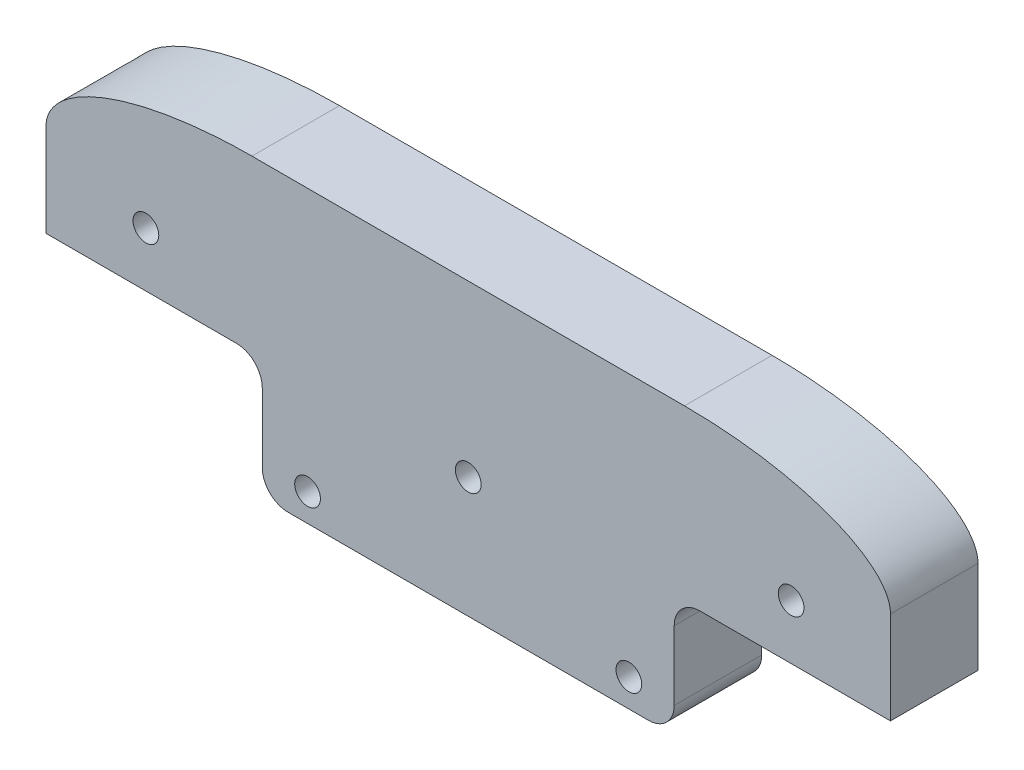
ISO-10303-21;
HEADER;
FILE_DESCRIPTION(('STEP AP214'),'2;1');
FILE_NAME('part.step','',(''),(''),'','','');
FILE_SCHEMA(('AUTOMOTIVE_DESIGN { 1 0 10303 214 1 1 1 1 }'));
ENDSEC;
DATA;
#1=APPLICATION_CONTEXT('core data for automotive mechanical design processes');
#2=APPLICATION_PROTOCOL_DEFINITION('international standard','automotive_design',2000,#1);
#3=PRODUCT_CONTEXT('',#1,'mechanical');
#4=PRODUCT('Part','Part','',(#3));
#5=PRODUCT_RELATED_PRODUCT_CATEGORY('part','',(#4));
#6=PRODUCT_DEFINITION_FORMATION('','',#4);
#7=PRODUCT_DEFINITION_CONTEXT('part definition',#1,'design');
#8=PRODUCT_DEFINITION('design','',#6,#7);
#9=PRODUCT_DEFINITION_SHAPE('','',#8);
#10=(LENGTH_UNIT() NAMED_UNIT(*) SI_UNIT(.MILLI.,.METRE.));
#11=(NAMED_UNIT(*) PLANE_ANGLE_UNIT() SI_UNIT($,.RADIAN.));
#12=(NAMED_UNIT(*) SI_UNIT($,.STERADIAN.) SOLID_ANGLE_UNIT());
#13=UNCERTAINTY_MEASURE_WITH_UNIT(LENGTH_MEASURE(1.E-05),#10,'distance_accuracy_value','');
#14=(GEOMETRIC_REPRESENTATION_CONTEXT(3) GLOBAL_UNCERTAINTY_ASSIGNED_CONTEXT((#13)) GLOBAL_UNIT_ASSIGNED_CONTEXT((#10,
#11,#12)) REPRESENTATION_CONTEXT('',''));
#15=CARTESIAN_POINT('',(0.,0.,0.));
#16=DIRECTION('',(0.,0.,1.));
#17=DIRECTION('',(1.,0.,0.));
#18=AXIS2_PLACEMENT_3D('',#15,#16,#17);
#19=CARTESIAN_POINT('',(0.,0.,17.));
#20=DIRECTION('',(-1.,0.,0.));
#21=DIRECTION('',(0.,-1.,0.));
#22=AXIS2_PLACEMENT_3D('',#19,#20,#21);
#23=PLANE('',#22);
#24=DIRECTION('',(0.,1.,0.));
#25=VECTOR('',#24,1.);
#26=CARTESIAN_POINT('',(0.,0.,17.));
#27=LINE('',#26,#25);
#28=CARTESIAN_POINT('',(0.,5.,17.));
#29=VERTEX_POINT('',#28);
#30=CARTESIAN_POINT('',(0.,18.4,17.));
#31=VERTEX_POINT('',#30);
#32=EDGE_CURVE('E176',#29,#31,#27,.T.);
#33=ORIENTED_EDGE('',*,*,#32,.F.);
#34=DIRECTION('',(0.,0.,-1.));
#35=VECTOR('',#34,1.);
#36=CARTESIAN_POINT('',(0.,5.,0.));
#37=LINE('',#36,#35);
#38=CARTESIAN_POINT('',(0.,5.,0.));
#39=VERTEX_POINT('',#38);
#40=EDGE_CURVE('E328',#29,#39,#37,.T.);
#41=ORIENTED_EDGE('',*,*,#40,.T.);
#42=DIRECTION('',(0.,1.,0.));
#43=VECTOR('',#42,1.);
#44=CARTESIAN_POINT('',(0.,0.,0.));
#45=LINE('',#44,#43);
#46=CARTESIAN_POINT('',(0.,18.4,0.));
#47=VERTEX_POINT('',#46);
#48=EDGE_CURVE('E425',#39,#47,#45,.T.);
#49=ORIENTED_EDGE('',*,*,#48,.T.);
#50=DIRECTION('',(0.,0.,-1.));
#51=VECTOR('',#50,1.);
#52=CARTESIAN_POINT('',(0.,18.4,17.));
#53=LINE('',#52,#51);
#54=EDGE_CURVE('E320',#47,#31,#53,.F.);
#55=ORIENTED_EDGE('',*,*,#54,.T.);
#56=EDGE_LOOP('',(#33,#41,#49,#55));
#57=FACE_BOUND('',#56,.T.);
#58=ADVANCED_FACE('F45',(#57),#23,.F.);
#59=CARTESIAN_POINT('',(0.,23.4,17.));
#60=DIRECTION('',(0.,-1.,0.));
#61=DIRECTION('',(1.,0.,0.));
#62=AXIS2_PLACEMENT_3D('',#59,#60,#61);
#63=PLANE('',#62);
#64=DIRECTION('',(-1.,0.,0.));
#65=VECTOR('',#64,1.);
#66=CARTESIAN_POINT('',(0.,23.4,17.));
#67=LINE('',#66,#65);
#68=CARTESIAN_POINT('',(42.,23.4,17.));
#69=VERTEX_POINT('',#68);
#70=CARTESIAN_POINT('',(5.,23.4,17.));
#71=VERTEX_POINT('',#70);
#72=EDGE_CURVE('E160',#69,#71,#67,.T.);
#73=ORIENTED_EDGE('',*,*,#72,.T.);
#74=DIRECTION('',(0.,0.,-1.));
#75=VECTOR('',#74,1.);
#76=CARTESIAN_POINT('',(5.,23.4,17.));
#77=LINE('',#76,#75);
#78=CARTESIAN_POINT('',(5.,23.4,0.));
#79=VERTEX_POINT('',#78);
#80=EDGE_CURVE('E358',#71,#79,#77,.T.);
#81=ORIENTED_EDGE('',*,*,#80,.T.);
#82=DIRECTION('',(-1.,0.,0.));
#83=VECTOR('',#82,1.);
#84=CARTESIAN_POINT('',(0.,23.4,0.));
#85=LINE('',#84,#83);
#86=CARTESIAN_POINT('',(42.,23.4,0.));
#87=VERTEX_POINT('',#86);
#88=EDGE_CURVE('E167',#87,#79,#85,.T.);
#89=ORIENTED_EDGE('',*,*,#88,.F.);
#90=DIRECTION('',(0.,0.,-1.));
#91=VECTOR('',#90,1.);
#92=CARTESIAN_POINT('',(42.,23.4,17.));
#93=LINE('',#92,#91);
#94=EDGE_CURVE('E152',#69,#87,#93,.T.);
#95=ORIENTED_EDGE('',*,*,#94,.F.);
#96=EDGE_LOOP('',(#73,#81,#89,#95));
#97=FACE_BOUND('',#96,.T.);
#98=ADVANCED_FACE('F163',(#97),#63,.T.);
#99=CARTESIAN_POINT('',(42.,0.,17.));
#100=DIRECTION('',(1.,0.,0.));
#101=DIRECTION('',(0.,0.,-1.));
#102=AXIS2_PLACEMENT_3D('',#99,#100,#101);
#103=PLANE('',#102);
#104=DIRECTION('',(0.,-1.,0.));
#105=VECTOR('',#104,1.);
#106=CARTESIAN_POINT('',(42.,0.,0.));
#107=LINE('',#106,#105);
#108=CARTESIAN_POINT('',(42.,41.39,0.));
#109=VERTEX_POINT('',#108);
#110=EDGE_CURVE('E431',#109,#87,#107,.T.);
#111=ORIENTED_EDGE('',*,*,#110,.F.);
#112=CARTESIAN_POINT('',(42.,41.39,17.85));
#113=CARTESIAN_POINT('',(42.,41.39,11.6166666666667));
#114=CARTESIAN_POINT('',(42.,41.39,5.38333333333333));
#115=CARTESIAN_POINT('',(42.,41.39,-0.849999999999997));
#116=(BOUNDED_CURVE() B_SPLINE_CURVE(3,(#112,#113,#114,#115),.UNSPECIFIED.,.F.,
.F.) B_SPLINE_CURVE_WITH_KNOTS((4,4),(-0.00085,0.01785),
.UNSPECIFIED.) CURVE() GEOMETRIC_REPRESENTATION_ITEM() RATIONAL_B_SPLINE_CURVE((1.,1.,1.,1.)) REPRESENTATION_ITEM(''));
#117=CARTESIAN_POINT('',(42.,41.39,17.));
#118=VERTEX_POINT('',#117);
#119=EDGE_CURVE('E155',#109,#118,#116,.F.);
#120=ORIENTED_EDGE('',*,*,#119,.T.);
#121=DIRECTION('',(0.,-1.,0.));
#122=VECTOR('',#121,1.);
#123=CARTESIAN_POINT('',(42.,0.,17.));
#124=LINE('',#123,#122);
#125=EDGE_CURVE('E148',#118,#69,#124,.T.);
#126=ORIENTED_EDGE('',*,*,#125,.T.);
#127=ORIENTED_EDGE('',*,*,#94,.T.);
#128=EDGE_LOOP('',(#111,#120,#126,#127));
#129=FACE_BOUND('',#128,.T.);
#130=ADVANCED_FACE('F151',(#129),#103,.T.);
#131=CARTESIAN_POINT('',(0.,56.39,17.));
#132=DIRECTION('',(0.,1.,0.));
#133=DIRECTION('',(0.,0.,1.));
#134=AXIS2_PLACEMENT_3D('',#131,#132,#133);
#135=PLANE('',#134);
#136=DIRECTION('',(1.,0.,0.));
#137=VECTOR('',#136,1.);
#138=CARTESIAN_POINT('',(0.,56.39,17.));
#139=LINE('',#138,#137);
#140=CARTESIAN_POINT('',(-82.,56.39,17.));
#141=VERTEX_POINT('',#140);
#142=CARTESIAN_POINT('',(2.00000000000001,56.39,17.));
#143=VERTEX_POINT('',#142);
#144=EDGE_CURVE('E159',#141,#143,#139,.T.);
#145=ORIENTED_EDGE('',*,*,#144,.T.);
#146=CARTESIAN_POINT('',(2.00000000000001,56.39,-0.849999999999997));
#147=CARTESIAN_POINT('',(2.00000000000001,56.39,5.38333333333333));
#148=CARTESIAN_POINT('',(2.00000000000001,56.39,11.6166666666667));
#149=CARTESIAN_POINT('',(2.00000000000001,56.39,17.85));
#150=(BOUNDED_CURVE() B_SPLINE_CURVE(3,(#146,#147,#148,#149),.UNSPECIFIED.,.F.,
.F.) B_SPLINE_CURVE_WITH_KNOTS((4,4),(-0.00085,0.01785),
.UNSPECIFIED.) CURVE() GEOMETRIC_REPRESENTATION_ITEM() RATIONAL_B_SPLINE_CURVE((1.,1.,1.,1.)) REPRESENTATION_ITEM(''));
#151=CARTESIAN_POINT('',(2.00000000000001,56.39,0.));
#152=VERTEX_POINT('',#151);
#153=EDGE_CURVE('E489',#143,#152,#150,.F.);
#154=ORIENTED_EDGE('',*,*,#153,.T.);
#155=DIRECTION('',(1.,0.,0.));
#156=VECTOR('',#155,1.);
#157=CARTESIAN_POINT('',(0.,56.39,0.));
#158=LINE('',#157,#156);
#159=CARTESIAN_POINT('',(-82.,56.39,0.));
#160=VERTEX_POINT('',#159);
#161=EDGE_CURVE('E440',#160,#152,#158,.T.);
#162=ORIENTED_EDGE('',*,*,#161,.F.);
#163=CARTESIAN_POINT('',(-82.,56.39,17.85));
#164=CARTESIAN_POINT('',(-82.,56.39,11.6166666666667));
#165=CARTESIAN_POINT('',(-82.,56.39,5.38333333333332));
#166=CARTESIAN_POINT('',(-82.,56.39,-0.85));
#167=(BOUNDED_CURVE() B_SPLINE_CURVE(3,(#163,#164,#165,#166),.UNSPECIFIED.,.F.,
.F.) B_SPLINE_CURVE_WITH_KNOTS((4,4),(-0.01785,0.00085),
.UNSPECIFIED.) CURVE() GEOMETRIC_REPRESENTATION_ITEM() RATIONAL_B_SPLINE_CURVE((1.,1.,1.,1.)) REPRESENTATION_ITEM(''));
#168=EDGE_CURVE('E169',#160,#141,#167,.F.);
#169=ORIENTED_EDGE('',*,*,#168,.T.);
#170=EDGE_LOOP('',(#145,#154,#162,#169));
#171=FACE_BOUND('',#170,.T.);
#172=ADVANCED_FACE('F208',(#171),#135,.T.);
#173=CARTESIAN_POINT('',(-122.,0.,17.));
#174=DIRECTION('',(1.,0.,0.));
#175=DIRECTION('',(0.,0.,-1.));
#176=AXIS2_PLACEMENT_3D('',#173,#174,#175);
#177=PLANE('',#176);
#178=DIRECTION('',(0.,-1.,0.));
#179=VECTOR('',#178,1.);
#180=CARTESIAN_POINT('',(-122.,0.,17.));
#181=LINE('',#180,#179);
#182=CARTESIAN_POINT('',(-122.,41.39,17.));
#183=VERTEX_POINT('',#182);
#184=CARTESIAN_POINT('',(-122.,23.4,17.));
#185=VERTEX_POINT('',#184);
#186=EDGE_CURVE('E197',#183,#185,#181,.T.);
#187=ORIENTED_EDGE('',*,*,#186,.F.);
#188=CARTESIAN_POINT('',(-122.,41.39,-0.85));
#189=CARTESIAN_POINT('',(-122.,41.39,5.38333333333332));
#190=CARTESIAN_POINT('',(-122.,41.39,11.6166666666667));
#191=CARTESIAN_POINT('',(-122.,41.39,17.85));
#192=(BOUNDED_CURVE() B_SPLINE_CURVE(3,(#188,#189,#190,#191),.UNSPECIFIED.,.F.,
.F.) B_SPLINE_CURVE_WITH_KNOTS((4,4),(-0.01785,0.00085),
.UNSPECIFIED.) CURVE() GEOMETRIC_REPRESENTATION_ITEM() RATIONAL_B_SPLINE_CURVE((1.,1.,1.,1.)) REPRESENTATION_ITEM(''));
#193=CARTESIAN_POINT('',(-122.,41.39,0.));
#194=VERTEX_POINT('',#193);
#195=EDGE_CURVE('E297',#183,#194,#192,.F.);
#196=ORIENTED_EDGE('',*,*,#195,.T.);
#197=DIRECTION('',(0.,-1.,0.));
#198=VECTOR('',#197,1.);
#199=CARTESIAN_POINT('',(-122.,0.,0.));
#200=LINE('',#199,#198);
#201=CARTESIAN_POINT('',(-122.,23.4,0.));
#202=VERTEX_POINT('',#201);
#203=EDGE_CURVE('E388',#194,#202,#200,.T.);
#204=ORIENTED_EDGE('',*,*,#203,.T.);
#205=DIRECTION('',(0.,0.,-1.));
#206=VECTOR('',#205,1.);
#207=CARTESIAN_POINT('',(-122.,23.4,17.));
#208=LINE('',#207,#206);
#209=EDGE_CURVE('E170',#185,#202,#208,.T.);
#210=ORIENTED_EDGE('',*,*,#209,.F.);
#211=EDGE_LOOP('',(#187,#196,#204,#210));
#212=FACE_BOUND('',#211,.T.);
#213=ADVANCED_FACE('F472',(#212),#177,.F.);
#214=CARTESIAN_POINT('',(0.,23.4,17.));
#215=DIRECTION('',(0.,1.,0.));
#216=DIRECTION('',(0.,0.,1.));
#217=AXIS2_PLACEMENT_3D('',#214,#215,#216);
#218=PLANE('',#217);
#219=DIRECTION('',(1.,0.,0.));
#220=VECTOR('',#219,1.);
#221=CARTESIAN_POINT('',(0.,23.4,0.));
#222=LINE('',#221,#220);
#223=CARTESIAN_POINT('',(-85.,23.4,0.));
#224=VERTEX_POINT('',#223);
#225=EDGE_CURVE('E376',#202,#224,#222,.T.);
#226=ORIENTED_EDGE('',*,*,#225,.T.);
#227=DIRECTION('',(0.,0.,-1.));
#228=VECTOR('',#227,1.);
#229=CARTESIAN_POINT('',(-85.,23.4,17.));
#230=LINE('',#229,#228);
#231=CARTESIAN_POINT('',(-85.,23.4,17.));
#232=VERTEX_POINT('',#231);
#233=EDGE_CURVE('E361',#224,#232,#230,.F.);
#234=ORIENTED_EDGE('',*,*,#233,.T.);
#235=DIRECTION('',(1.,0.,0.));
#236=VECTOR('',#235,1.);
#237=CARTESIAN_POINT('',(0.,23.4,17.));
#238=LINE('',#237,#236);
#239=EDGE_CURVE('E397',#185,#232,#238,.T.);
#240=ORIENTED_EDGE('',*,*,#239,.F.);
#241=ORIENTED_EDGE('',*,*,#209,.T.);
#242=EDGE_LOOP('',(#226,#234,#240,#241));
#243=FACE_BOUND('',#242,.T.);
#244=ADVANCED_FACE('F384',(#243),#218,.F.);
#245=CARTESIAN_POINT('',(-80.,0.,17.));
#246=DIRECTION('',(-1.,0.,0.));
#247=DIRECTION('',(0.,0.,1.));
#248=AXIS2_PLACEMENT_3D('',#245,#246,#247);
#249=PLANE('',#248);
#250=DIRECTION('',(0.,1.,0.));
#251=VECTOR('',#250,1.);
#252=CARTESIAN_POINT('',(-80.,0.,0.));
#253=LINE('',#252,#251);
#254=CARTESIAN_POINT('',(-80.,5.,0.));
#255=VERTEX_POINT('',#254);
#256=CARTESIAN_POINT('',(-80.,18.4,0.));
#257=VERTEX_POINT('',#256);
#258=EDGE_CURVE('E378',#255,#257,#253,.T.);
#259=ORIENTED_EDGE('',*,*,#258,.F.);
#260=DIRECTION('',(0.,0.,-1.));
#261=VECTOR('',#260,1.);
#262=CARTESIAN_POINT('',(-80.,5.,17.));
#263=LINE('',#262,#261);
#264=CARTESIAN_POINT('',(-80.,5.,17.));
#265=VERTEX_POINT('',#264);
#266=EDGE_CURVE('E355',#255,#265,#263,.F.);
#267=ORIENTED_EDGE('',*,*,#266,.T.);
#268=DIRECTION('',(0.,1.,0.));
#269=VECTOR('',#268,1.);
#270=CARTESIAN_POINT('',(-80.,0.,17.));
#271=LINE('',#270,#269);
#272=CARTESIAN_POINT('',(-80.,18.4,17.));
#273=VERTEX_POINT('',#272);
#274=EDGE_CURVE('E393',#265,#273,#271,.T.);
#275=ORIENTED_EDGE('',*,*,#274,.T.);
#276=DIRECTION('',(0.,0.,-1.));
#277=VECTOR('',#276,1.);
#278=CARTESIAN_POINT('',(-80.,18.4,17.));
#279=LINE('',#278,#277);
#280=EDGE_CURVE('E351',#273,#257,#279,.T.);
#281=ORIENTED_EDGE('',*,*,#280,.T.);
#282=EDGE_LOOP('',(#259,#267,#275,#281));
#283=FACE_BOUND('',#282,.T.);
#284=ADVANCED_FACE('F391',(#283),#249,.T.);
#285=CARTESIAN_POINT('',(-8.8,5.4,17.));
#286=DIRECTION('',(0.,0.,-1.));
#287=DIRECTION('',(-1.,0.,0.));
#288=AXIS2_PLACEMENT_3D('',#285,#286,#287);
#289=CYLINDRICAL_SURFACE('',#288,2.5);
#290=CARTESIAN_POINT('',(-8.8,5.4,17.));
#291=DIRECTION('',(0.,0.,1.));
#292=DIRECTION('',(1.,0.,0.));
#293=AXIS2_PLACEMENT_3D('',#290,#291,#292);
#294=CIRCLE('',#293,2.5);
#295=CARTESIAN_POINT('',(-6.3,5.4,17.));
#296=VERTEX_POINT('',#295);
#297=EDGE_CURVE('E402',#296,#296,#294,.T.);
#298=ORIENTED_EDGE('',*,*,#297,.T.);
#299=EDGE_LOOP('',(#298));
#300=FACE_BOUND('',#299,.T.);
#301=CARTESIAN_POINT('',(-8.8,5.4,0.));
#302=DIRECTION('',(0.,0.,1.));
#303=DIRECTION('',(1.,0.,0.));
#304=AXIS2_PLACEMENT_3D('',#301,#302,#303);
#305=CIRCLE('',#304,2.5);
#306=CARTESIAN_POINT('',(-6.3,5.4,0.));
#307=VERTEX_POINT('',#306);
#308=EDGE_CURVE('E542',#307,#307,#305,.T.);
#309=ORIENTED_EDGE('',*,*,#308,.F.);
#310=EDGE_LOOP('',(#309));
#311=FACE_BOUND('',#310,.T.);
#312=ADVANCED_FACE('F462',(#300,#311),#289,.F.);
#313=CARTESIAN_POINT('',(0.,0.,17.));
#314=DIRECTION('',(0.,-1.,0.));
#315=DIRECTION('',(0.,0.,-1.));
#316=AXIS2_PLACEMENT_3D('',#313,#314,#315);
#317=PLANE('',#316);
#318=DIRECTION('',(-1.,0.,0.));
#319=VECTOR('',#318,1.);
#320=CARTESIAN_POINT('',(0.,0.,0.));
#321=LINE('',#320,#319);
#322=CARTESIAN_POINT('',(-5.,0.,0.));
#323=VERTEX_POINT('',#322);
#324=CARTESIAN_POINT('',(-75.,0.,0.));
#325=VERTEX_POINT('',#324);
#326=EDGE_CURVE('E546',#323,#325,#321,.T.);
#327=ORIENTED_EDGE('',*,*,#326,.F.);
#328=DIRECTION('',(0.,0.,-1.));
#329=VECTOR('',#328,1.);
#330=CARTESIAN_POINT('',(-5.,0.,17.));
#331=LINE('',#330,#329);
#332=CARTESIAN_POINT('',(-5.,0.,17.));
#333=VERTEX_POINT('',#332);
#334=EDGE_CURVE('E342',#323,#333,#331,.F.);
#335=ORIENTED_EDGE('',*,*,#334,.T.);
#336=DIRECTION('',(-1.,0.,0.));
#337=VECTOR('',#336,1.);
#338=CARTESIAN_POINT('',(0.,0.,17.));
#339=LINE('',#338,#337);
#340=CARTESIAN_POINT('',(-75.,0.,17.));
#341=VERTEX_POINT('',#340);
#342=EDGE_CURVE('E396',#333,#341,#339,.T.);
#343=ORIENTED_EDGE('',*,*,#342,.T.);
#344=DIRECTION('',(0.,0.,-1.));
#345=VECTOR('',#344,1.);
#346=CARTESIAN_POINT('',(-75.,0.,17.));
#347=LINE('',#346,#345);
#348=EDGE_CURVE('E338',#341,#325,#347,.T.);
#349=ORIENTED_EDGE('',*,*,#348,.T.);
#350=EDGE_LOOP('',(#327,#335,#343,#349));
#351=FACE_BOUND('',#350,.T.);
#352=ADVANCED_FACE('F220',(#351),#317,.T.);
#353=CARTESIAN_POINT('',(-102.6,34.,17.));
#354=DIRECTION('',(0.,0.,-1.));
#355=DIRECTION('',(-1.,0.,0.));
#356=AXIS2_PLACEMENT_3D('',#353,#354,#355);
#357=CYLINDRICAL_SURFACE('',#356,2.5);
#358=CARTESIAN_POINT('',(-102.6,34.,17.));
#359=DIRECTION('',(0.,0.,1.));
#360=DIRECTION('',(1.,0.,0.));
#361=AXIS2_PLACEMENT_3D('',#358,#359,#360);
#362=CIRCLE('',#361,2.5);
#363=CARTESIAN_POINT('',(-100.1,34.,17.));
#364=VERTEX_POINT('',#363);
#365=EDGE_CURVE('E179',#364,#364,#362,.T.);
#366=ORIENTED_EDGE('',*,*,#365,.T.);
#367=EDGE_LOOP('',(#366));
#368=FACE_BOUND('',#367,.T.);
#369=CARTESIAN_POINT('',(-102.6,34.,0.));
#370=DIRECTION('',(0.,0.,1.));
#371=DIRECTION('',(1.,0.,0.));
#372=AXIS2_PLACEMENT_3D('',#369,#370,#371);
#373=CIRCLE('',#372,2.5);
#374=CARTESIAN_POINT('',(-100.1,34.,0.));
#375=VERTEX_POINT('',#374);
#376=EDGE_CURVE('E421',#375,#375,#373,.T.);
#377=ORIENTED_EDGE('',*,*,#376,.F.);
#378=EDGE_LOOP('',(#377));
#379=FACE_BOUND('',#378,.T.);
#380=ADVANCED_FACE('F216',(#368,#379),#357,.F.);
#381=CARTESIAN_POINT('',(22.705,34.,17.));
#382=DIRECTION('',(0.,0.,-1.));
#383=DIRECTION('',(-1.,0.,0.));
#384=AXIS2_PLACEMENT_3D('',#381,#382,#383);
#385=CYLINDRICAL_SURFACE('',#384,2.5);
#386=CARTESIAN_POINT('',(22.705,34.,17.));
#387=DIRECTION('',(0.,0.,1.));
#388=DIRECTION('',(1.,0.,0.));
#389=AXIS2_PLACEMENT_3D('',#386,#387,#388);
#390=CIRCLE('',#389,2.5);
#391=CARTESIAN_POINT('',(25.205,34.,17.));
#392=VERTEX_POINT('',#391);
#393=EDGE_CURVE('E555',#392,#392,#390,.T.);
#394=ORIENTED_EDGE('',*,*,#393,.T.);
#395=EDGE_LOOP('',(#394));
#396=FACE_BOUND('',#395,.T.);
#397=CARTESIAN_POINT('',(22.705,34.,0.));
#398=DIRECTION('',(0.,0.,1.));
#399=DIRECTION('',(1.,0.,0.));
#400=AXIS2_PLACEMENT_3D('',#397,#398,#399);
#401=CIRCLE('',#400,2.5);
#402=CARTESIAN_POINT('',(25.205,34.,0.));
#403=VERTEX_POINT('',#402);
#404=EDGE_CURVE('E417',#403,#403,#401,.T.);
#405=ORIENTED_EDGE('',*,*,#404,.F.);
#406=EDGE_LOOP('',(#405));
#407=FACE_BOUND('',#406,.T.);
#408=ADVANCED_FACE('F219',(#396,#407),#385,.F.);
#409=CARTESIAN_POINT('',(-40.,23.4,17.));
#410=DIRECTION('',(0.,0.,-1.));
#411=DIRECTION('',(-1.,0.,0.));
#412=AXIS2_PLACEMENT_3D('',#409,#410,#411);
#413=CYLINDRICAL_SURFACE('',#412,2.5);
#414=CARTESIAN_POINT('',(-40.,23.4,17.));
#415=DIRECTION('',(0.,0.,1.));
#416=DIRECTION('',(1.,0.,0.));
#417=AXIS2_PLACEMENT_3D('',#414,#415,#416);
#418=CIRCLE('',#417,2.5);
#419=CARTESIAN_POINT('',(-37.5,23.4,17.));
#420=VERTEX_POINT('',#419);
#421=EDGE_CURVE('E541',#420,#420,#418,.T.);
#422=ORIENTED_EDGE('',*,*,#421,.T.);
#423=EDGE_LOOP('',(#422));
#424=FACE_BOUND('',#423,.T.);
#425=CARTESIAN_POINT('',(-40.,23.4,0.));
#426=DIRECTION('',(0.,0.,1.));
#427=DIRECTION('',(1.,0.,0.));
#428=AXIS2_PLACEMENT_3D('',#425,#426,#427);
#429=CIRCLE('',#428,2.5);
#430=CARTESIAN_POINT('',(-37.5,23.4,0.));
#431=VERTEX_POINT('',#430);
#432=EDGE_CURVE('E413',#431,#431,#429,.T.);
#433=ORIENTED_EDGE('',*,*,#432,.F.);
#434=EDGE_LOOP('',(#433));
#435=FACE_BOUND('',#434,.T.);
#436=ADVANCED_FACE('F224',(#424,#435),#413,.F.);
#437=CARTESIAN_POINT('',(-71.2,5.40000000000001,17.));
#438=DIRECTION('',(0.,0.,-1.));
#439=DIRECTION('',(-1.,0.,0.));
#440=AXIS2_PLACEMENT_3D('',#437,#438,#439);
#441=CYLINDRICAL_SURFACE('',#440,2.49999999999999);
#442=CARTESIAN_POINT('',(-71.2,5.40000000000001,17.));
#443=DIRECTION('',(0.,0.,1.));
#444=DIRECTION('',(1.,0.,0.));
#445=AXIS2_PLACEMENT_3D('',#442,#443,#444);
#446=CIRCLE('',#445,2.49999999999999);
#447=CARTESIAN_POINT('',(-68.7,5.40000000000001,17.));
#448=VERTEX_POINT('',#447);
#449=EDGE_CURVE('E409',#448,#448,#446,.T.);
#450=ORIENTED_EDGE('',*,*,#449,.T.);
#451=EDGE_LOOP('',(#450));
#452=FACE_BOUND('',#451,.T.);
#453=CARTESIAN_POINT('',(-71.2,5.40000000000001,0.));
#454=DIRECTION('',(0.,0.,1.));
#455=DIRECTION('',(1.,0.,0.));
#456=AXIS2_PLACEMENT_3D('',#453,#454,#455);
#457=CIRCLE('',#456,2.49999999999999);
#458=CARTESIAN_POINT('',(-68.7,5.40000000000001,0.));
#459=VERTEX_POINT('',#458);
#460=EDGE_CURVE('E537',#459,#459,#457,.T.);
#461=ORIENTED_EDGE('',*,*,#460,.F.);
#462=EDGE_LOOP('',(#461));
#463=FACE_BOUND('',#462,.T.);
#464=ADVANCED_FACE('F228',(#452,#463),#441,.F.);
#465=CARTESIAN_POINT('',(0.,0.,17.));
#466=DIRECTION('',(0.,0.,1.));
#467=DIRECTION('',(1.,0.,0.));
#468=AXIS2_PLACEMENT_3D('',#465,#466,#467);
#469=PLANE('',#468);
#470=ORIENTED_EDGE('',*,*,#421,.F.);
#471=EDGE_LOOP('',(#470));
#472=FACE_BOUND('',#471,.T.);
#473=ORIENTED_EDGE('',*,*,#393,.F.);
#474=EDGE_LOOP('',(#473));
#475=FACE_BOUND('',#474,.T.);
#476=ORIENTED_EDGE('',*,*,#365,.F.);
#477=EDGE_LOOP('',(#476));
#478=FACE_BOUND('',#477,.T.);
#479=ORIENTED_EDGE('',*,*,#342,.F.);
#480=CARTESIAN_POINT('',(-5.,5.,17.));
#481=DIRECTION('',(0.,0.,1.));
#482=DIRECTION('',(1.,0.,0.));
#483=AXIS2_PLACEMENT_3D('',#480,#481,#482);
#484=CIRCLE('',#483,5.);
#485=EDGE_CURVE('E348',#333,#29,#484,.T.);
#486=ORIENTED_EDGE('',*,*,#485,.T.);
#487=ORIENTED_EDGE('',*,*,#32,.T.);
#488=CARTESIAN_POINT('',(5.,18.4,17.));
#489=DIRECTION('',(0.,0.,1.));
#490=DIRECTION('',(1.,0.,0.));
#491=AXIS2_PLACEMENT_3D('',#488,#489,#490);
#492=CIRCLE('',#491,5.);
#493=EDGE_CURVE('E61',#31,#71,#492,.F.);
#494=ORIENTED_EDGE('',*,*,#493,.T.);
#495=ORIENTED_EDGE('',*,*,#72,.F.);
#496=ORIENTED_EDGE('',*,*,#125,.F.);
#497=CARTESIAN_POINT('',(2.00000000000001,56.39,17.));
#498=CARTESIAN_POINT('',(42.,56.39,17.));
#499=CARTESIAN_POINT('',(42.,41.39,17.));
#500=(BOUNDED_CURVE() B_SPLINE_CURVE(2,(#497,#498,#499),.UNSPECIFIED.,.F.,
.F.) B_SPLINE_CURVE_WITH_KNOTS((3,3),(0.,1.),
.UNSPECIFIED.) CURVE() GEOMETRIC_REPRESENTATION_ITEM() RATIONAL_B_SPLINE_CURVE((1.,
0.707106781186548,1.)) REPRESENTATION_ITEM(''));
#501=EDGE_CURVE('E513',#118,#143,#500,.F.);
#502=ORIENTED_EDGE('',*,*,#501,.T.);
#503=ORIENTED_EDGE('',*,*,#144,.F.);
#504=CARTESIAN_POINT('',(-122.,41.39,17.));
#505=CARTESIAN_POINT('',(-122.,56.39,17.));
#506=CARTESIAN_POINT('',(-82.,56.39,17.));
#507=(BOUNDED_CURVE() B_SPLINE_CURVE(2,(#504,#505,#506),.UNSPECIFIED.,.F.,
.F.) B_SPLINE_CURVE_WITH_KNOTS((3,3),(0.,1.),
.UNSPECIFIED.) CURVE() GEOMETRIC_REPRESENTATION_ITEM() RATIONAL_B_SPLINE_CURVE((1.,
0.707106781186548,1.)) REPRESENTATION_ITEM(''));
#508=EDGE_CURVE('E307',#141,#183,#507,.F.);
#509=ORIENTED_EDGE('',*,*,#508,.T.);
#510=ORIENTED_EDGE('',*,*,#186,.T.);
#511=ORIENTED_EDGE('',*,*,#239,.T.);
#512=CARTESIAN_POINT('',(-85.,18.4,17.));
#513=DIRECTION('',(0.,0.,1.));
#514=DIRECTION('',(1.,0.,0.));
#515=AXIS2_PLACEMENT_3D('',#512,#513,#514);
#516=CIRCLE('',#515,5.);
#517=EDGE_CURVE('E12',#232,#273,#516,.F.);
#518=ORIENTED_EDGE('',*,*,#517,.T.);
#519=ORIENTED_EDGE('',*,*,#274,.F.);
#520=CARTESIAN_POINT('',(-75.,5.,17.));
#521=DIRECTION('',(0.,0.,1.));
#522=DIRECTION('',(1.,0.,0.));
#523=AXIS2_PLACEMENT_3D('',#520,#521,#522);
#524=CIRCLE('',#523,5.);
#525=EDGE_CURVE('E345',#265,#341,#524,.T.);
#526=ORIENTED_EDGE('',*,*,#525,.T.);
#527=EDGE_LOOP('',(#479,#486,#487,#494,#495,#496,#502,#503,#509,#510,#511,#518,#519,#526));
#528=FACE_BOUND('',#527,.T.);
#529=ORIENTED_EDGE('',*,*,#297,.F.);
#530=EDGE_LOOP('',(#529));
#531=FACE_BOUND('',#530,.T.);
#532=ORIENTED_EDGE('',*,*,#449,.F.);
#533=EDGE_LOOP('',(#532));
#534=FACE_BOUND('',#533,.T.);
#535=ADVANCED_FACE('F173',(#472,#475,#478,#528,#531,#534),#469,.T.);
#536=CARTESIAN_POINT('',(0.,0.,0.));
#537=DIRECTION('',(0.,0.,1.));
#538=DIRECTION('',(1.,0.,0.));
#539=AXIS2_PLACEMENT_3D('',#536,#537,#538);
#540=PLANE('',#539);
#541=ORIENTED_EDGE('',*,*,#432,.T.);
#542=EDGE_LOOP('',(#541));
#543=FACE_BOUND('',#542,.T.);
#544=ORIENTED_EDGE('',*,*,#404,.T.);
#545=EDGE_LOOP('',(#544));
#546=FACE_BOUND('',#545,.T.);
#547=ORIENTED_EDGE('',*,*,#376,.T.);
#548=EDGE_LOOP('',(#547));
#549=FACE_BOUND('',#548,.T.);
#550=ORIENTED_EDGE('',*,*,#48,.F.);
#551=CARTESIAN_POINT('',(-5.,5.,0.));
#552=DIRECTION('',(0.,0.,1.));
#553=DIRECTION('',(1.,0.,0.));
#554=AXIS2_PLACEMENT_3D('',#551,#552,#553);
#555=CIRCLE('',#554,5.);
#556=EDGE_CURVE('E335',#39,#323,#555,.F.);
#557=ORIENTED_EDGE('',*,*,#556,.T.);
#558=ORIENTED_EDGE('',*,*,#326,.T.);
#559=CARTESIAN_POINT('',(-75.,5.,0.));
#560=DIRECTION('',(0.,0.,1.));
#561=DIRECTION('',(1.,0.,0.));
#562=AXIS2_PLACEMENT_3D('',#559,#560,#561);
#563=CIRCLE('',#562,5.);
#564=EDGE_CURVE('E332',#325,#255,#563,.F.);
#565=ORIENTED_EDGE('',*,*,#564,.T.);
#566=ORIENTED_EDGE('',*,*,#258,.T.);
#567=CARTESIAN_POINT('',(-85.,18.4,0.));
#568=DIRECTION('',(0.,0.,1.));
#569=DIRECTION('',(1.,0.,0.));
#570=AXIS2_PLACEMENT_3D('',#567,#568,#569);
#571=CIRCLE('',#570,5.);
#572=EDGE_CURVE('E54',#257,#224,#571,.T.);
#573=ORIENTED_EDGE('',*,*,#572,.T.);
#574=ORIENTED_EDGE('',*,*,#225,.F.);
#575=ORIENTED_EDGE('',*,*,#203,.F.);
#576=CARTESIAN_POINT('',(-82.,56.39,0.));
#577=CARTESIAN_POINT('',(-122.,56.39,0.));
#578=CARTESIAN_POINT('',(-122.,41.39,0.));
#579=(BOUNDED_CURVE() B_SPLINE_CURVE(2,(#576,#577,#578),.UNSPECIFIED.,.F.,
.F.) B_SPLINE_CURVE_WITH_KNOTS((3,3),(0.,1.),
.UNSPECIFIED.) CURVE() GEOMETRIC_REPRESENTATION_ITEM() RATIONAL_B_SPLINE_CURVE((1.,
0.707106781186548,1.)) REPRESENTATION_ITEM(''));
#580=EDGE_CURVE('E285',#194,#160,#579,.F.);
#581=ORIENTED_EDGE('',*,*,#580,.T.);
#582=ORIENTED_EDGE('',*,*,#161,.T.);
#583=CARTESIAN_POINT('',(42.,41.39,0.));
#584=CARTESIAN_POINT('',(42.,56.39,0.));
#585=CARTESIAN_POINT('',(2.00000000000001,56.39,0.));
#586=(BOUNDED_CURVE() B_SPLINE_CURVE(2,(#583,#584,#585),.UNSPECIFIED.,.F.,
.F.) B_SPLINE_CURVE_WITH_KNOTS((3,3),(0.,1.),
.UNSPECIFIED.) CURVE() GEOMETRIC_REPRESENTATION_ITEM() RATIONAL_B_SPLINE_CURVE((1.,
0.707106781186548,1.)) REPRESENTATION_ITEM(''));
#587=EDGE_CURVE('E487',#152,#109,#586,.F.);
#588=ORIENTED_EDGE('',*,*,#587,.T.);
#589=ORIENTED_EDGE('',*,*,#110,.T.);
#590=ORIENTED_EDGE('',*,*,#88,.T.);
#591=CARTESIAN_POINT('',(5.,18.4,0.));
#592=DIRECTION('',(0.,0.,1.));
#593=DIRECTION('',(1.,0.,0.));
#594=AXIS2_PLACEMENT_3D('',#591,#592,#593);
#595=CIRCLE('',#594,5.);
#596=EDGE_CURVE('E364',#79,#47,#595,.T.);
#597=ORIENTED_EDGE('',*,*,#596,.T.);
#598=EDGE_LOOP('',(#550,#557,#558,#565,#566,#573,#574,#575,#581,#582,#588,#589,#590,#597));
#599=FACE_BOUND('',#598,.T.);
#600=ORIENTED_EDGE('',*,*,#308,.T.);
#601=EDGE_LOOP('',(#600));
#602=FACE_BOUND('',#601,.T.);
#603=ORIENTED_EDGE('',*,*,#460,.T.);
#604=EDGE_LOOP('',(#603));
#605=FACE_BOUND('',#604,.T.);
#606=ADVANCED_FACE('F240',(#543,#546,#549,#599,#602,#605),#540,.F.);
#607=CARTESIAN_POINT('',(2.00000000000001,56.39,17.85));
#608=CARTESIAN_POINT('',(2.00000000000001,56.39,11.6166666666667));
#609=CARTESIAN_POINT('',(2.00000000000001,56.39,5.38333333333333));
#610=CARTESIAN_POINT('',(2.00000000000001,56.39,-0.849999999999997));
#611=CARTESIAN_POINT('',(42.,56.39,17.85));
#612=CARTESIAN_POINT('',(42.,56.39,11.6166666666667));
#613=CARTESIAN_POINT('',(42.,56.39,5.38333333333335));
#614=CARTESIAN_POINT('',(42.,56.39,-0.849999999999997));
#615=CARTESIAN_POINT('',(42.,41.39,17.85));
#616=CARTESIAN_POINT('',(42.,41.39,11.6166666666667));
#617=CARTESIAN_POINT('',(42.,41.39,5.38333333333333));
#618=CARTESIAN_POINT('',(42.,41.39,-0.849999999999997));
#619=(BOUNDED_SURFACE() B_SPLINE_SURFACE(2,3,((#607,#608,#609,#610),(#611,#612,#613,#614),(#615,
#616,#617,#618)),.UNSPECIFIED.,.F.,.F.,.F.) B_SPLINE_SURFACE_WITH_KNOTS((3,3),(4,4),(0.,1.),
(-0.00085,0.01785),
.UNSPECIFIED.) GEOMETRIC_REPRESENTATION_ITEM() RATIONAL_B_SPLINE_SURFACE(((1.,1.,1.,1.),
(0.707106781186548,0.707106781186548,0.707106781186548,0.707106781186548),(1.,1.,1.,1.))) REPRESENTATION_ITEM('') SURFACE());
#620=ORIENTED_EDGE('',*,*,#501,.F.);
#621=ORIENTED_EDGE('',*,*,#119,.F.);
#622=ORIENTED_EDGE('',*,*,#587,.F.);
#623=ORIENTED_EDGE('',*,*,#153,.F.);
#624=EDGE_LOOP('',(#620,#621,#622,#623));
#625=FACE_BOUND('',#624,.T.);
#626=ADVANCED_FACE('F231',(#625),#619,.T.);
#627=CARTESIAN_POINT('',(-82.,56.39,-0.85));
#628=CARTESIAN_POINT('',(-82.,56.39,5.38333333333332));
#629=CARTESIAN_POINT('',(-82.,56.39,11.6166666666667));
#630=CARTESIAN_POINT('',(-82.,56.39,17.85));
#631=CARTESIAN_POINT('',(-122.,56.39,-0.85));
#632=CARTESIAN_POINT('',(-122.,56.39,5.38333333333332));
#633=CARTESIAN_POINT('',(-122.,56.39,11.6166666666667));
#634=CARTESIAN_POINT('',(-122.,56.39,17.85));
#635=CARTESIAN_POINT('',(-122.,41.39,-0.85));
#636=CARTESIAN_POINT('',(-122.,41.39,5.38333333333332));
#637=CARTESIAN_POINT('',(-122.,41.39,11.6166666666667));
#638=CARTESIAN_POINT('',(-122.,41.39,17.85));
#639=(BOUNDED_SURFACE() B_SPLINE_SURFACE(2,3,((#627,#628,#629,#630),(#631,#632,#633,#634),(#635,
#636,#637,#638)),.UNSPECIFIED.,.F.,.F.,.F.) B_SPLINE_SURFACE_WITH_KNOTS((3,3),(4,4),(0.,1.),
(-0.01785,0.00085),
.UNSPECIFIED.) GEOMETRIC_REPRESENTATION_ITEM() RATIONAL_B_SPLINE_SURFACE(((1.,1.,1.,1.),
(0.707106781186548,0.707106781186548,0.707106781186548,0.707106781186548),(1.,1.,1.,1.))) REPRESENTATION_ITEM('') SURFACE());
#640=ORIENTED_EDGE('',*,*,#508,.F.);
#641=ORIENTED_EDGE('',*,*,#168,.F.);
#642=ORIENTED_EDGE('',*,*,#580,.F.);
#643=ORIENTED_EDGE('',*,*,#195,.F.);
#644=EDGE_LOOP('',(#640,#641,#642,#643));
#645=FACE_BOUND('',#644,.T.);
#646=ADVANCED_FACE('F239',(#645),#639,.T.);
#647=CARTESIAN_POINT('',(-5.,5.,17.));
#648=DIRECTION('',(0.,0.,1.));
#649=DIRECTION('',(1.,0.,0.));
#650=AXIS2_PLACEMENT_3D('',#647,#648,#649);
#651=CYLINDRICAL_SURFACE('',#650,5.);
#652=ORIENTED_EDGE('',*,*,#485,.F.);
#653=ORIENTED_EDGE('',*,*,#334,.F.);
#654=ORIENTED_EDGE('',*,*,#556,.F.);
#655=ORIENTED_EDGE('',*,*,#40,.F.);
#656=EDGE_LOOP('',(#652,#653,#654,#655));
#657=FACE_BOUND('',#656,.T.);
#658=ADVANCED_FACE('F597',(#657),#651,.T.);
#659=CARTESIAN_POINT('',(-75.,5.,17.));
#660=DIRECTION('',(0.,0.,-1.));
#661=DIRECTION('',(-1.,0.,0.));
#662=AXIS2_PLACEMENT_3D('',#659,#660,#661);
#663=CYLINDRICAL_SURFACE('',#662,5.);
#664=ORIENTED_EDGE('',*,*,#525,.F.);
#665=ORIENTED_EDGE('',*,*,#266,.F.);
#666=ORIENTED_EDGE('',*,*,#564,.F.);
#667=ORIENTED_EDGE('',*,*,#348,.F.);
#668=EDGE_LOOP('',(#664,#665,#666,#667));
#669=FACE_BOUND('',#668,.T.);
#670=ADVANCED_FACE('F603',(#669),#663,.T.);
#671=CARTESIAN_POINT('',(5.,18.4,17.));
#672=DIRECTION('',(0.,0.,-1.));
#673=DIRECTION('',(-1.,0.,0.));
#674=AXIS2_PLACEMENT_3D('',#671,#672,#673);
#675=CYLINDRICAL_SURFACE('',#674,5.);
#676=ORIENTED_EDGE('',*,*,#493,.F.);
#677=ORIENTED_EDGE('',*,*,#54,.F.);
#678=ORIENTED_EDGE('',*,*,#596,.F.);
#679=ORIENTED_EDGE('',*,*,#80,.F.);
#680=EDGE_LOOP('',(#676,#677,#678,#679));
#681=FACE_BOUND('',#680,.T.);
#682=ADVANCED_FACE('F610',(#681),#675,.F.);
#683=CARTESIAN_POINT('',(-85.,18.4,17.));
#684=DIRECTION('',(0.,0.,-1.));
#685=DIRECTION('',(-1.,0.,0.));
#686=AXIS2_PLACEMENT_3D('',#683,#684,#685);
#687=CYLINDRICAL_SURFACE('',#686,5.);
#688=ORIENTED_EDGE('',*,*,#517,.F.);
#689=ORIENTED_EDGE('',*,*,#233,.F.);
#690=ORIENTED_EDGE('',*,*,#572,.F.);
#691=ORIENTED_EDGE('',*,*,#280,.F.);
#692=EDGE_LOOP('',(#688,#689,#690,#691));
#693=FACE_BOUND('',#692,.T.);
#694=ADVANCED_FACE('F47',(#693),#687,.F.);
#695=CLOSED_SHELL('',(#58,#98,#130,#172,#213,#244,#284,#312,#352,#380,#408,#436,#464,#535,#606,
#626,#646,#658,#670,#682,#694));
#696=MANIFOLD_SOLID_BREP('B2',#695);
#697=ADVANCED_BREP_SHAPE_REPRESENTATION('',(#18,#696),#14);
#698=SHAPE_DEFINITION_REPRESENTATION(#9,#697);
ENDSEC;
END-ISO-10303-21;
